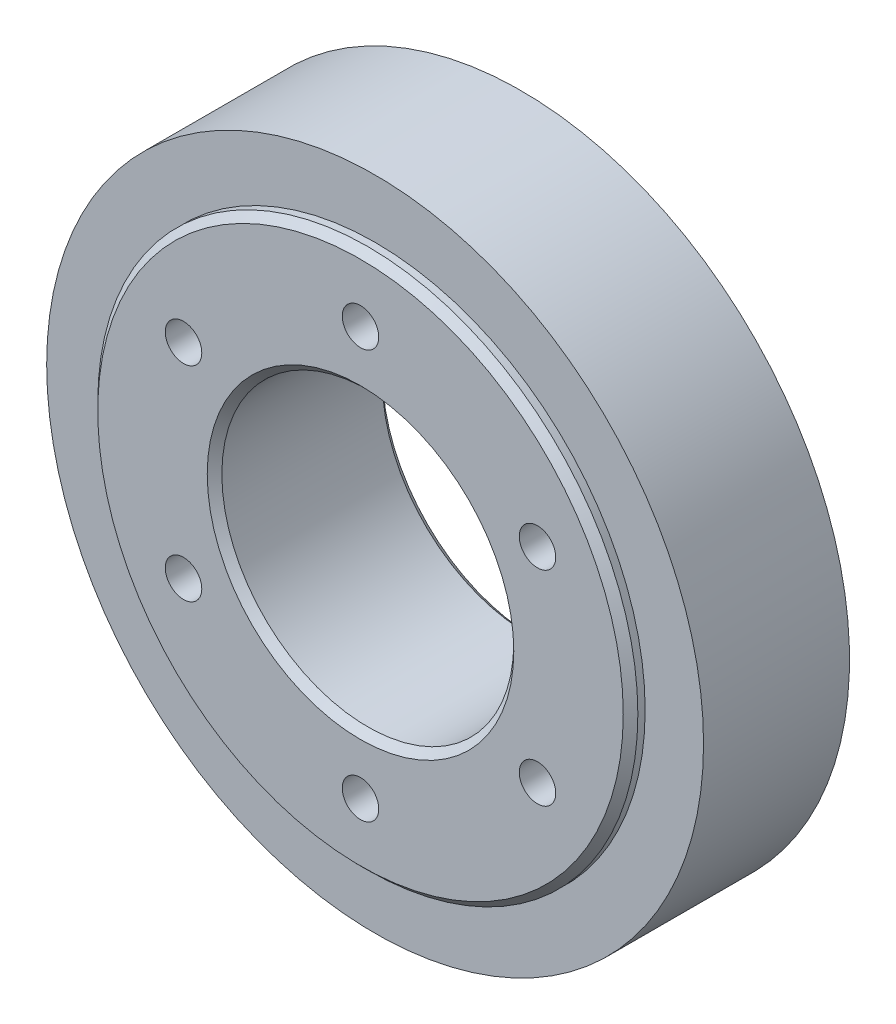
ISO-10303-21;
HEADER;
FILE_DESCRIPTION(('STEP AP214'),'2;1');
FILE_NAME('part.step','',(''),(''),'','','');
FILE_SCHEMA(('AUTOMOTIVE_DESIGN { 1 0 10303 214 1 1 1 1 }'));
ENDSEC;
DATA;
#1=APPLICATION_CONTEXT('core data for automotive mechanical design processes');
#2=APPLICATION_PROTOCOL_DEFINITION('international standard','automotive_design',2000,#1);
#3=PRODUCT_CONTEXT('',#1,'mechanical');
#4=PRODUCT('Part','Part','',(#3));
#5=PRODUCT_RELATED_PRODUCT_CATEGORY('part','',(#4));
#6=PRODUCT_DEFINITION_FORMATION('','',#4);
#7=PRODUCT_DEFINITION_CONTEXT('part definition',#1,'design');
#8=PRODUCT_DEFINITION('design','',#6,#7);
#9=PRODUCT_DEFINITION_SHAPE('','',#8);
#10=(LENGTH_UNIT() NAMED_UNIT(*) SI_UNIT(.MILLI.,.METRE.));
#11=(NAMED_UNIT(*) PLANE_ANGLE_UNIT() SI_UNIT($,.RADIAN.));
#12=(NAMED_UNIT(*) SI_UNIT($,.STERADIAN.) SOLID_ANGLE_UNIT());
#13=UNCERTAINTY_MEASURE_WITH_UNIT(LENGTH_MEASURE(1.E-05),#10,'distance_accuracy_value','');
#14=(GEOMETRIC_REPRESENTATION_CONTEXT(3) GLOBAL_UNCERTAINTY_ASSIGNED_CONTEXT((#13)) GLOBAL_UNIT_ASSIGNED_CONTEXT((#10,
#11,#12)) REPRESENTATION_CONTEXT('',''));
#15=CARTESIAN_POINT('',(0.,0.,0.));
#16=DIRECTION('',(0.,0.,1.));
#17=DIRECTION('',(1.,0.,0.));
#18=AXIS2_PLACEMENT_3D('',#15,#16,#17);
#19=CARTESIAN_POINT('',(0.,0.,6.));
#20=DIRECTION('',(0.,0.,-1.));
#21=DIRECTION('',(-1.,0.,0.));
#22=AXIS2_PLACEMENT_3D('',#19,#20,#21);
#23=CYLINDRICAL_SURFACE('',#22,22.5);
#24=CARTESIAN_POINT('',(0.,0.,-5.));
#25=DIRECTION('',(0.,0.,-1.));
#26=DIRECTION('',(-1.,0.,0.));
#27=AXIS2_PLACEMENT_3D('',#24,#25,#26);
#28=CIRCLE('',#27,22.5);
#29=CARTESIAN_POINT('',(-22.5,0.,-5.));
#30=VERTEX_POINT('',#29);
#31=EDGE_CURVE('E71',#30,#30,#28,.T.);
#32=ORIENTED_EDGE('',*,*,#31,.F.);
#33=EDGE_LOOP('',(#32));
#34=FACE_BOUND('',#33,.T.);
#35=CARTESIAN_POINT('',(0.,0.,5.));
#36=DIRECTION('',(0.,0.,1.));
#37=DIRECTION('',(1.,0.,0.));
#38=AXIS2_PLACEMENT_3D('',#35,#36,#37);
#39=CIRCLE('',#38,22.5);
#40=CARTESIAN_POINT('',(22.5,0.,5.));
#41=VERTEX_POINT('',#40);
#42=EDGE_CURVE('E72',#41,#41,#39,.T.);
#43=ORIENTED_EDGE('',*,*,#42,.F.);
#44=EDGE_LOOP('',(#43));
#45=FACE_BOUND('',#44,.T.);
#46=ADVANCED_FACE('F39',(#34,#45),#23,.T.);
#47=CARTESIAN_POINT('',(0.,0.,-6.));
#48=DIRECTION('',(0.,0.,1.));
#49=DIRECTION('',(1.,0.,0.));
#50=AXIS2_PLACEMENT_3D('',#47,#48,#49);
#51=PLANE('',#50);
#52=CARTESIAN_POINT('',(0.,0.,-6.));
#53=DIRECTION('',(0.,0.,1.));
#54=DIRECTION('',(1.,0.,0.));
#55=AXIS2_PLACEMENT_3D('',#52,#53,#54);
#56=CIRCLE('',#55,10.5);
#57=CARTESIAN_POINT('',(10.5,0.,-6.));
#58=VERTEX_POINT('',#57);
#59=EDGE_CURVE('E65',#58,#58,#56,.T.);
#60=ORIENTED_EDGE('',*,*,#59,.T.);
#61=EDGE_LOOP('',(#60));
#62=FACE_BOUND('',#61,.T.);
#63=CARTESIAN_POINT('',(0.,0.,-6.));
#64=DIRECTION('',(0.,0.,1.));
#65=DIRECTION('',(1.,0.,0.));
#66=AXIS2_PLACEMENT_3D('',#63,#64,#65);
#67=CIRCLE('',#66,18.);
#68=CARTESIAN_POINT('',(18.,0.,-6.));
#69=VERTEX_POINT('',#68);
#70=EDGE_CURVE('E68',#69,#69,#67,.F.);
#71=ORIENTED_EDGE('',*,*,#70,.T.);
#72=EDGE_LOOP('',(#71));
#73=FACE_BOUND('',#72,.T.);
#74=CARTESIAN_POINT('',(-12.1243556529821,7.00000000000014,-6.));
#75=DIRECTION('',(0.,0.,1.));
#76=DIRECTION('',(1.,0.,0.));
#77=AXIS2_PLACEMENT_3D('',#74,#75,#76);
#78=CIRCLE('',#77,1.25);
#79=CARTESIAN_POINT('',(-10.8743556529821,7.00000000000014,-6.));
#80=VERTEX_POINT('',#79);
#81=EDGE_CURVE('E113',#80,#80,#78,.T.);
#82=ORIENTED_EDGE('',*,*,#81,.T.);
#83=EDGE_LOOP('',(#82));
#84=FACE_BOUND('',#83,.T.);
#85=CARTESIAN_POINT('',(-12.1243556529822,-6.99999999999989,-6.));
#86=DIRECTION('',(0.,0.,1.));
#87=DIRECTION('',(1.,0.,0.));
#88=AXIS2_PLACEMENT_3D('',#85,#86,#87);
#89=CIRCLE('',#88,1.25);
#90=CARTESIAN_POINT('',(-10.8743556529822,-6.99999999999989,-6.));
#91=VERTEX_POINT('',#90);
#92=EDGE_CURVE('E107',#91,#91,#89,.T.);
#93=ORIENTED_EDGE('',*,*,#92,.T.);
#94=EDGE_LOOP('',(#93));
#95=FACE_BOUND('',#94,.T.);
#96=CARTESIAN_POINT('',(0.,-14.,-6.));
#97=DIRECTION('',(0.,0.,1.));
#98=DIRECTION('',(1.,0.,0.));
#99=AXIS2_PLACEMENT_3D('',#96,#97,#98);
#100=CIRCLE('',#99,1.25);
#101=CARTESIAN_POINT('',(1.25,-14.,-6.));
#102=VERTEX_POINT('',#101);
#103=EDGE_CURVE('E101',#102,#102,#100,.T.);
#104=ORIENTED_EDGE('',*,*,#103,.T.);
#105=EDGE_LOOP('',(#104));
#106=FACE_BOUND('',#105,.T.);
#107=CARTESIAN_POINT('',(12.1243556529821,-7.00000000000006,-6.));
#108=DIRECTION('',(0.,0.,1.));
#109=DIRECTION('',(1.,0.,0.));
#110=AXIS2_PLACEMENT_3D('',#107,#108,#109);
#111=CIRCLE('',#110,1.25);
#112=CARTESIAN_POINT('',(13.3743556529821,-7.00000000000006,-6.));
#113=VERTEX_POINT('',#112);
#114=EDGE_CURVE('E95',#113,#113,#111,.T.);
#115=ORIENTED_EDGE('',*,*,#114,.T.);
#116=EDGE_LOOP('',(#115));
#117=FACE_BOUND('',#116,.T.);
#118=CARTESIAN_POINT('',(12.1243556529822,6.99999999999997,-6.));
#119=DIRECTION('',(0.,0.,1.));
#120=DIRECTION('',(1.,0.,0.));
#121=AXIS2_PLACEMENT_3D('',#118,#119,#120);
#122=CIRCLE('',#121,1.25);
#123=CARTESIAN_POINT('',(13.3743556529822,6.99999999999997,-6.));
#124=VERTEX_POINT('',#123);
#125=EDGE_CURVE('E89',#124,#124,#122,.T.);
#126=ORIENTED_EDGE('',*,*,#125,.T.);
#127=EDGE_LOOP('',(#126));
#128=FACE_BOUND('',#127,.T.);
#129=CARTESIAN_POINT('',(0.,14.,-6.));
#130=DIRECTION('',(0.,0.,1.));
#131=DIRECTION('',(1.,0.,0.));
#132=AXIS2_PLACEMENT_3D('',#129,#130,#131);
#133=CIRCLE('',#132,1.25);
#134=CARTESIAN_POINT('',(1.25,14.,-6.));
#135=VERTEX_POINT('',#134);
#136=EDGE_CURVE('E83',#135,#135,#133,.T.);
#137=ORIENTED_EDGE('',*,*,#136,.T.);
#138=EDGE_LOOP('',(#137));
#139=FACE_BOUND('',#138,.T.);
#140=ADVANCED_FACE('F126',(#62,#73,#84,#95,#106,#117,#128,#139),#51,.F.);
#141=CARTESIAN_POINT('',(0.,0.,6.));
#142=DIRECTION('',(0.,0.,1.));
#143=DIRECTION('',(1.,0.,0.));
#144=AXIS2_PLACEMENT_3D('',#141,#142,#143);
#145=PLANE('',#144);
#146=CARTESIAN_POINT('',(0.,0.,6.));
#147=DIRECTION('',(0.,0.,1.));
#148=DIRECTION('',(1.,0.,0.));
#149=AXIS2_PLACEMENT_3D('',#146,#147,#148);
#150=CIRCLE('',#149,10.5);
#151=CARTESIAN_POINT('',(10.5,0.,6.));
#152=VERTEX_POINT('',#151);
#153=EDGE_CURVE('E50',#152,#152,#150,.F.);
#154=ORIENTED_EDGE('',*,*,#153,.T.);
#155=EDGE_LOOP('',(#154));
#156=FACE_BOUND('',#155,.T.);
#157=CARTESIAN_POINT('',(0.,0.,6.));
#158=DIRECTION('',(0.,0.,1.));
#159=DIRECTION('',(1.,0.,0.));
#160=AXIS2_PLACEMENT_3D('',#157,#158,#159);
#161=CIRCLE('',#160,18.);
#162=CARTESIAN_POINT('',(18.,0.,6.));
#163=VERTEX_POINT('',#162);
#164=EDGE_CURVE('E54',#163,#163,#161,.T.);
#165=ORIENTED_EDGE('',*,*,#164,.T.);
#166=EDGE_LOOP('',(#165));
#167=FACE_BOUND('',#166,.T.);
#168=CARTESIAN_POINT('',(-12.1243556529821,7.00000000000014,6.));
#169=DIRECTION('',(0.,0.,1.));
#170=DIRECTION('',(1.,0.,0.));
#171=AXIS2_PLACEMENT_3D('',#168,#169,#170);
#172=CIRCLE('',#171,1.25);
#173=CARTESIAN_POINT('',(-10.8743556529821,7.00000000000014,6.));
#174=VERTEX_POINT('',#173);
#175=EDGE_CURVE('E116',#174,#174,#172,.T.);
#176=ORIENTED_EDGE('',*,*,#175,.F.);
#177=EDGE_LOOP('',(#176));
#178=FACE_BOUND('',#177,.T.);
#179=CARTESIAN_POINT('',(-12.1243556529822,-6.99999999999989,6.));
#180=DIRECTION('',(0.,0.,1.));
#181=DIRECTION('',(1.,0.,0.));
#182=AXIS2_PLACEMENT_3D('',#179,#180,#181);
#183=CIRCLE('',#182,1.25);
#184=CARTESIAN_POINT('',(-10.8743556529822,-6.99999999999989,6.));
#185=VERTEX_POINT('',#184);
#186=EDGE_CURVE('E110',#185,#185,#183,.T.);
#187=ORIENTED_EDGE('',*,*,#186,.F.);
#188=EDGE_LOOP('',(#187));
#189=FACE_BOUND('',#188,.T.);
#190=CARTESIAN_POINT('',(0.,-14.,6.));
#191=DIRECTION('',(0.,0.,1.));
#192=DIRECTION('',(1.,0.,0.));
#193=AXIS2_PLACEMENT_3D('',#190,#191,#192);
#194=CIRCLE('',#193,1.25);
#195=CARTESIAN_POINT('',(1.25,-14.,6.));
#196=VERTEX_POINT('',#195);
#197=EDGE_CURVE('E104',#196,#196,#194,.T.);
#198=ORIENTED_EDGE('',*,*,#197,.F.);
#199=EDGE_LOOP('',(#198));
#200=FACE_BOUND('',#199,.T.);
#201=CARTESIAN_POINT('',(12.1243556529821,-7.00000000000006,6.));
#202=DIRECTION('',(0.,0.,1.));
#203=DIRECTION('',(1.,0.,0.));
#204=AXIS2_PLACEMENT_3D('',#201,#202,#203);
#205=CIRCLE('',#204,1.25);
#206=CARTESIAN_POINT('',(13.3743556529821,-7.00000000000006,6.));
#207=VERTEX_POINT('',#206);
#208=EDGE_CURVE('E98',#207,#207,#205,.T.);
#209=ORIENTED_EDGE('',*,*,#208,.F.);
#210=EDGE_LOOP('',(#209));
#211=FACE_BOUND('',#210,.T.);
#212=CARTESIAN_POINT('',(12.1243556529822,6.99999999999997,6.));
#213=DIRECTION('',(0.,0.,1.));
#214=DIRECTION('',(1.,0.,0.));
#215=AXIS2_PLACEMENT_3D('',#212,#213,#214);
#216=CIRCLE('',#215,1.25);
#217=CARTESIAN_POINT('',(13.3743556529822,6.99999999999997,6.));
#218=VERTEX_POINT('',#217);
#219=EDGE_CURVE('E92',#218,#218,#216,.T.);
#220=ORIENTED_EDGE('',*,*,#219,.F.);
#221=EDGE_LOOP('',(#220));
#222=FACE_BOUND('',#221,.T.);
#223=CARTESIAN_POINT('',(0.,14.,6.));
#224=DIRECTION('',(0.,0.,1.));
#225=DIRECTION('',(1.,0.,0.));
#226=AXIS2_PLACEMENT_3D('',#223,#224,#225);
#227=CIRCLE('',#226,1.25);
#228=CARTESIAN_POINT('',(1.25,14.,6.));
#229=VERTEX_POINT('',#228);
#230=EDGE_CURVE('E86',#229,#229,#227,.T.);
#231=ORIENTED_EDGE('',*,*,#230,.F.);
#232=EDGE_LOOP('',(#231));
#233=FACE_BOUND('',#232,.T.);
#234=ADVANCED_FACE('F122',(#156,#167,#178,#189,#200,#211,#222,#233),#145,.T.);
#235=CARTESIAN_POINT('',(0.,0.,6.));
#236=DIRECTION('',(0.,0.,-1.));
#237=DIRECTION('',(-1.,0.,0.));
#238=AXIS2_PLACEMENT_3D('',#235,#236,#237);
#239=CYLINDRICAL_SURFACE('',#238,10.);
#240=CARTESIAN_POINT('',(0.,0.,-5.49999999999999));
#241=DIRECTION('',(0.,0.,1.));
#242=DIRECTION('',(1.,0.,0.));
#243=AXIS2_PLACEMENT_3D('',#240,#241,#242);
#244=CIRCLE('',#243,10.);
#245=CARTESIAN_POINT('',(10.,0.,-5.49999999999999));
#246=VERTEX_POINT('',#245);
#247=EDGE_CURVE('E59',#246,#246,#244,.F.);
#248=ORIENTED_EDGE('',*,*,#247,.T.);
#249=EDGE_LOOP('',(#248));
#250=FACE_BOUND('',#249,.T.);
#251=CARTESIAN_POINT('',(0.,0.,5.5));
#252=DIRECTION('',(0.,0.,1.));
#253=DIRECTION('',(1.,0.,0.));
#254=AXIS2_PLACEMENT_3D('',#251,#252,#253);
#255=CIRCLE('',#254,10.);
#256=CARTESIAN_POINT('',(10.,0.,5.5));
#257=VERTEX_POINT('',#256);
#258=EDGE_CURVE('E62',#257,#257,#255,.T.);
#259=ORIENTED_EDGE('',*,*,#258,.T.);
#260=EDGE_LOOP('',(#259));
#261=FACE_BOUND('',#260,.T.);
#262=ADVANCED_FACE('F125',(#250,#261),#239,.F.);
#263=CARTESIAN_POINT('',(0.,0.,-5.));
#264=DIRECTION('',(0.,0.,-1.));
#265=DIRECTION('',(-1.,0.,0.));
#266=AXIS2_PLACEMENT_3D('',#263,#264,#265);
#267=PLANE('',#266);
#268=CARTESIAN_POINT('',(0.,0.,-5.));
#269=DIRECTION('',(0.,0.,-1.));
#270=DIRECTION('',(-1.,0.,0.));
#271=AXIS2_PLACEMENT_3D('',#268,#269,#270);
#272=CIRCLE('',#271,18.5);
#273=CARTESIAN_POINT('',(-18.5,0.,-5.));
#274=VERTEX_POINT('',#273);
#275=EDGE_CURVE('E75',#274,#274,#272,.T.);
#276=ORIENTED_EDGE('',*,*,#275,.F.);
#277=EDGE_LOOP('',(#276));
#278=FACE_BOUND('',#277,.T.);
#279=ORIENTED_EDGE('',*,*,#31,.T.);
#280=EDGE_LOOP('',(#279));
#281=FACE_BOUND('',#280,.T.);
#282=ADVANCED_FACE('F301',(#278,#281),#267,.T.);
#283=CARTESIAN_POINT('',(0.,0.,-5.));
#284=DIRECTION('',(0.,0.,-1.));
#285=DIRECTION('',(-1.,0.,0.));
#286=AXIS2_PLACEMENT_3D('',#283,#284,#285);
#287=CYLINDRICAL_SURFACE('',#286,18.5);
#288=CARTESIAN_POINT('',(0.,0.,-5.5));
#289=DIRECTION('',(0.,0.,1.));
#290=DIRECTION('',(1.,0.,0.));
#291=AXIS2_PLACEMENT_3D('',#288,#289,#290);
#292=CIRCLE('',#291,18.5);
#293=CARTESIAN_POINT('',(18.5,0.,-5.5));
#294=VERTEX_POINT('',#293);
#295=EDGE_CURVE('E11',#294,#294,#292,.T.);
#296=ORIENTED_EDGE('',*,*,#295,.T.);
#297=EDGE_LOOP('',(#296));
#298=FACE_BOUND('',#297,.T.);
#299=ORIENTED_EDGE('',*,*,#275,.T.);
#300=EDGE_LOOP('',(#299));
#301=FACE_BOUND('',#300,.T.);
#302=ADVANCED_FACE('F287',(#298,#301),#287,.T.);
#303=CARTESIAN_POINT('',(0.,0.,5.));
#304=DIRECTION('',(0.,0.,1.));
#305=DIRECTION('',(1.,0.,0.));
#306=AXIS2_PLACEMENT_3D('',#303,#304,#305);
#307=PLANE('',#306);
#308=CARTESIAN_POINT('',(0.,0.,5.));
#309=DIRECTION('',(0.,0.,-1.));
#310=DIRECTION('',(-1.,0.,0.));
#311=AXIS2_PLACEMENT_3D('',#308,#309,#310);
#312=CIRCLE('',#311,18.5);
#313=CARTESIAN_POINT('',(-18.5,0.,5.));
#314=VERTEX_POINT('',#313);
#315=EDGE_CURVE('E76',#314,#314,#312,.T.);
#316=ORIENTED_EDGE('',*,*,#315,.T.);
#317=EDGE_LOOP('',(#316));
#318=FACE_BOUND('',#317,.T.);
#319=ORIENTED_EDGE('',*,*,#42,.T.);
#320=EDGE_LOOP('',(#319));
#321=FACE_BOUND('',#320,.T.);
#322=ADVANCED_FACE('F152',(#318,#321),#307,.T.);
#323=CARTESIAN_POINT('',(0.,0.,5.));
#324=DIRECTION('',(0.,0.,1.));
#325=DIRECTION('',(1.,0.,0.));
#326=AXIS2_PLACEMENT_3D('',#323,#324,#325);
#327=CYLINDRICAL_SURFACE('',#326,18.5);
#328=CARTESIAN_POINT('',(0.,0.,5.5));
#329=DIRECTION('',(0.,0.,1.));
#330=DIRECTION('',(1.,0.,0.));
#331=AXIS2_PLACEMENT_3D('',#328,#329,#330);
#332=CIRCLE('',#331,18.5);
#333=CARTESIAN_POINT('',(18.5,0.,5.5));
#334=VERTEX_POINT('',#333);
#335=EDGE_CURVE('E46',#334,#334,#332,.F.);
#336=ORIENTED_EDGE('',*,*,#335,.T.);
#337=EDGE_LOOP('',(#336));
#338=FACE_BOUND('',#337,.T.);
#339=ORIENTED_EDGE('',*,*,#315,.F.);
#340=EDGE_LOOP('',(#339));
#341=FACE_BOUND('',#340,.T.);
#342=ADVANCED_FACE('F142',(#338,#341),#327,.T.);
#343=CARTESIAN_POINT('',(0.,14.,6.));
#344=DIRECTION('',(0.,0.,1.));
#345=DIRECTION('',(1.,0.,0.));
#346=AXIS2_PLACEMENT_3D('',#343,#344,#345);
#347=CYLINDRICAL_SURFACE('',#346,1.25);
#348=ORIENTED_EDGE('',*,*,#136,.F.);
#349=EDGE_LOOP('',(#348));
#350=FACE_BOUND('',#349,.T.);
#351=ORIENTED_EDGE('',*,*,#230,.T.);
#352=EDGE_LOOP('',(#351));
#353=FACE_BOUND('',#352,.T.);
#354=ADVANCED_FACE('F139',(#350,#353),#347,.F.);
#355=CARTESIAN_POINT('',(12.1243556529822,6.99999999999997,6.));
#356=DIRECTION('',(0.,0.,1.));
#357=DIRECTION('',(1.,0.,0.));
#358=AXIS2_PLACEMENT_3D('',#355,#356,#357);
#359=CYLINDRICAL_SURFACE('',#358,1.25);
#360=ORIENTED_EDGE('',*,*,#125,.F.);
#361=EDGE_LOOP('',(#360));
#362=FACE_BOUND('',#361,.T.);
#363=ORIENTED_EDGE('',*,*,#219,.T.);
#364=EDGE_LOOP('',(#363));
#365=FACE_BOUND('',#364,.T.);
#366=ADVANCED_FACE('F141',(#362,#365),#359,.F.);
#367=CARTESIAN_POINT('',(12.1243556529821,-7.00000000000006,6.));
#368=DIRECTION('',(0.,0.,1.));
#369=DIRECTION('',(1.,0.,0.));
#370=AXIS2_PLACEMENT_3D('',#367,#368,#369);
#371=CYLINDRICAL_SURFACE('',#370,1.25);
#372=ORIENTED_EDGE('',*,*,#114,.F.);
#373=EDGE_LOOP('',(#372));
#374=FACE_BOUND('',#373,.T.);
#375=ORIENTED_EDGE('',*,*,#208,.T.);
#376=EDGE_LOOP('',(#375));
#377=FACE_BOUND('',#376,.T.);
#378=ADVANCED_FACE('F149',(#374,#377),#371,.F.);
#379=CARTESIAN_POINT('',(0.,-14.,6.));
#380=DIRECTION('',(0.,0.,1.));
#381=DIRECTION('',(1.,0.,0.));
#382=AXIS2_PLACEMENT_3D('',#379,#380,#381);
#383=CYLINDRICAL_SURFACE('',#382,1.25);
#384=ORIENTED_EDGE('',*,*,#103,.F.);
#385=EDGE_LOOP('',(#384));
#386=FACE_BOUND('',#385,.T.);
#387=ORIENTED_EDGE('',*,*,#197,.T.);
#388=EDGE_LOOP('',(#387));
#389=FACE_BOUND('',#388,.T.);
#390=ADVANCED_FACE('F203',(#386,#389),#383,.F.);
#391=CARTESIAN_POINT('',(-12.1243556529822,-6.99999999999989,6.));
#392=DIRECTION('',(0.,0.,1.));
#393=DIRECTION('',(1.,0.,0.));
#394=AXIS2_PLACEMENT_3D('',#391,#392,#393);
#395=CYLINDRICAL_SURFACE('',#394,1.25);
#396=ORIENTED_EDGE('',*,*,#92,.F.);
#397=EDGE_LOOP('',(#396));
#398=FACE_BOUND('',#397,.T.);
#399=ORIENTED_EDGE('',*,*,#186,.T.);
#400=EDGE_LOOP('',(#399));
#401=FACE_BOUND('',#400,.T.);
#402=ADVANCED_FACE('F208',(#398,#401),#395,.F.);
#403=CARTESIAN_POINT('',(-12.1243556529821,7.00000000000014,6.));
#404=DIRECTION('',(0.,0.,1.));
#405=DIRECTION('',(1.,0.,0.));
#406=AXIS2_PLACEMENT_3D('',#403,#404,#405);
#407=CYLINDRICAL_SURFACE('',#406,1.25);
#408=ORIENTED_EDGE('',*,*,#81,.F.);
#409=EDGE_LOOP('',(#408));
#410=FACE_BOUND('',#409,.T.);
#411=ORIENTED_EDGE('',*,*,#175,.T.);
#412=EDGE_LOOP('',(#411));
#413=FACE_BOUND('',#412,.T.);
#414=ADVANCED_FACE('F120',(#410,#413),#407,.F.);
#415=CARTESIAN_POINT('',(0.,0.,-6.));
#416=DIRECTION('',(0.,0.,-1.));
#417=DIRECTION('',(-1.,0.,0.));
#418=AXIS2_PLACEMENT_3D('',#415,#416,#417);
#419=CONICAL_SURFACE('',#418,10.5,0.785398163397441);
#420=ORIENTED_EDGE('',*,*,#247,.F.);
#421=EDGE_LOOP('',(#420));
#422=FACE_BOUND('',#421,.T.);
#423=ORIENTED_EDGE('',*,*,#59,.F.);
#424=EDGE_LOOP('',(#423));
#425=FACE_BOUND('',#424,.T.);
#426=ADVANCED_FACE('F166',(#422,#425),#419,.F.);
#427=CARTESIAN_POINT('',(0.,0.,5.5));
#428=DIRECTION('',(0.,0.,1.));
#429=DIRECTION('',(1.,0.,0.));
#430=AXIS2_PLACEMENT_3D('',#427,#428,#429);
#431=CONICAL_SURFACE('',#430,10.,0.785398163397448);
#432=ORIENTED_EDGE('',*,*,#153,.F.);
#433=EDGE_LOOP('',(#432));
#434=FACE_BOUND('',#433,.T.);
#435=ORIENTED_EDGE('',*,*,#258,.F.);
#436=EDGE_LOOP('',(#435));
#437=FACE_BOUND('',#436,.T.);
#438=ADVANCED_FACE('F169',(#434,#437),#431,.F.);
#439=CARTESIAN_POINT('',(0.,0.,5.5));
#440=DIRECTION('',(0.,0.,-1.));
#441=DIRECTION('',(-1.,0.,0.));
#442=AXIS2_PLACEMENT_3D('',#439,#440,#441);
#443=CONICAL_SURFACE('',#442,18.5,0.785398163397445);
#444=ORIENTED_EDGE('',*,*,#164,.F.);
#445=EDGE_LOOP('',(#444));
#446=FACE_BOUND('',#445,.T.);
#447=ORIENTED_EDGE('',*,*,#335,.F.);
#448=EDGE_LOOP('',(#447));
#449=FACE_BOUND('',#448,.T.);
#450=ADVANCED_FACE('F172',(#446,#449),#443,.T.);
#451=CARTESIAN_POINT('',(0.,0.,-6.));
#452=DIRECTION('',(0.,0.,1.));
#453=DIRECTION('',(1.,0.,0.));
#454=AXIS2_PLACEMENT_3D('',#451,#452,#453);
#455=CONICAL_SURFACE('',#454,18.,0.785398163397445);
#456=ORIENTED_EDGE('',*,*,#295,.F.);
#457=EDGE_LOOP('',(#456));
#458=FACE_BOUND('',#457,.T.);
#459=ORIENTED_EDGE('',*,*,#70,.F.);
#460=EDGE_LOOP('',(#459));
#461=FACE_BOUND('',#460,.T.);
#462=ADVANCED_FACE('F41',(#458,#461),#455,.T.);
#463=CLOSED_SHELL('',(#46,#140,#234,#262,#282,#302,#322,#342,#354,#366,#378,#390,#402,#414,#426,
#438,#450,#462));
#464=MANIFOLD_SOLID_BREP('B2',#463);
#465=ADVANCED_BREP_SHAPE_REPRESENTATION('',(#18,#464),#14);
#466=SHAPE_DEFINITION_REPRESENTATION(#9,#465);
ENDSEC;
END-ISO-10303-21;
